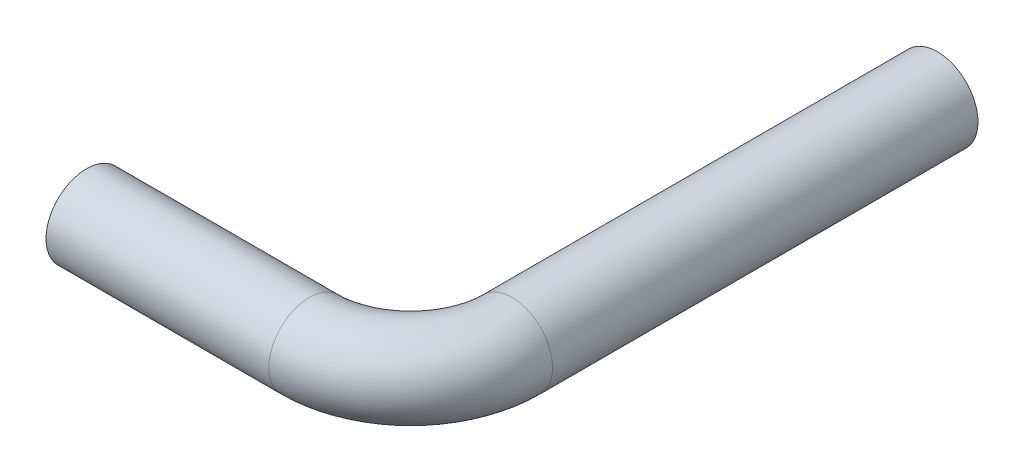
ISO-10303-21;
HEADER;
FILE_DESCRIPTION(('STEP AP214'),'2;1');
FILE_NAME('part.step','',(''),(''),'','','');
FILE_SCHEMA(('AUTOMOTIVE_DESIGN { 1 0 10303 214 1 1 1 1 }'));
ENDSEC;
DATA;
#1=APPLICATION_CONTEXT('core data for automotive mechanical design processes');
#2=APPLICATION_PROTOCOL_DEFINITION('international standard','automotive_design',2000,#1);
#3=PRODUCT_CONTEXT('',#1,'mechanical');
#4=PRODUCT('Part','Part','',(#3));
#5=PRODUCT_RELATED_PRODUCT_CATEGORY('part','',(#4));
#6=PRODUCT_DEFINITION_FORMATION('','',#4);
#7=PRODUCT_DEFINITION_CONTEXT('part definition',#1,'design');
#8=PRODUCT_DEFINITION('design','',#6,#7);
#9=PRODUCT_DEFINITION_SHAPE('','',#8);
#10=(LENGTH_UNIT() NAMED_UNIT(*) SI_UNIT(.MILLI.,.METRE.));
#11=(NAMED_UNIT(*) PLANE_ANGLE_UNIT() SI_UNIT($,.RADIAN.));
#12=(NAMED_UNIT(*) SI_UNIT($,.STERADIAN.) SOLID_ANGLE_UNIT());
#13=UNCERTAINTY_MEASURE_WITH_UNIT(LENGTH_MEASURE(1.E-05),#10,'distance_accuracy_value','');
#14=(GEOMETRIC_REPRESENTATION_CONTEXT(3) GLOBAL_UNCERTAINTY_ASSIGNED_CONTEXT((#13)) GLOBAL_UNIT_ASSIGNED_CONTEXT((#10,
#11,#12)) REPRESENTATION_CONTEXT('',''));
#15=CARTESIAN_POINT('',(0.,0.,0.));
#16=DIRECTION('',(0.,0.,1.));
#17=DIRECTION('',(1.,0.,0.));
#18=AXIS2_PLACEMENT_3D('',#15,#16,#17);
#19=CARTESIAN_POINT('',(148.,21.,95.));
#20=DIRECTION('',(-1.,0.,0.));
#21=DIRECTION('',(0.,0.,1.));
#22=AXIS2_PLACEMENT_3D('',#19,#20,#21);
#23=PLANE('',#22);
#24=CARTESIAN_POINT('',(148.,21.,95.));
#25=DIRECTION('',(-1.,0.,0.));
#26=DIRECTION('',(0.,0.,1.));
#27=AXIS2_PLACEMENT_3D('',#24,#25,#26);
#28=CIRCLE('',#27,3.);
#29=CARTESIAN_POINT('',(148.,21.,98.));
#30=VERTEX_POINT('',#29);
#31=EDGE_CURVE('E88',#30,#30,#28,.T.);
#32=ORIENTED_EDGE('',*,*,#31,.F.);
#33=EDGE_LOOP('',(#32));
#34=FACE_BOUND('',#33,.T.);
#35=CARTESIAN_POINT('',(148.,21.,95.));
#36=DIRECTION('',(-1.,0.,0.));
#37=DIRECTION('',(0.,0.,1.));
#38=AXIS2_PLACEMENT_3D('',#35,#36,#37);
#39=CIRCLE('',#38,4.);
#40=CARTESIAN_POINT('',(148.,21.,99.));
#41=VERTEX_POINT('',#40);
#42=EDGE_CURVE('E67',#41,#41,#39,.T.);
#43=ORIENTED_EDGE('',*,*,#42,.T.);
#44=EDGE_LOOP('',(#43));
#45=FACE_BOUND('',#44,.T.);
#46=ADVANCED_FACE('F52',(#34,#45),#23,.T.);
#47=CARTESIAN_POINT('',(180.,21.,43.));
#48=DIRECTION('',(0.,0.,1.));
#49=DIRECTION('',(1.,0.,0.));
#50=AXIS2_PLACEMENT_3D('',#47,#48,#49);
#51=PLANE('',#50);
#52=CARTESIAN_POINT('',(180.,21.,43.));
#53=DIRECTION('',(0.,0.,1.));
#54=DIRECTION('',(1.,0.,0.));
#55=AXIS2_PLACEMENT_3D('',#52,#53,#54);
#56=CIRCLE('',#55,3.);
#57=CARTESIAN_POINT('',(183.,21.,43.));
#58=VERTEX_POINT('',#57);
#59=EDGE_CURVE('E71',#58,#58,#56,.T.);
#60=ORIENTED_EDGE('',*,*,#59,.T.);
#61=EDGE_LOOP('',(#60));
#62=FACE_BOUND('',#61,.T.);
#63=CARTESIAN_POINT('',(180.,21.,43.));
#64=DIRECTION('',(0.,0.,1.));
#65=DIRECTION('',(1.,0.,0.));
#66=AXIS2_PLACEMENT_3D('',#63,#64,#65);
#67=CIRCLE('',#66,4.);
#68=CARTESIAN_POINT('',(184.,21.,43.));
#69=VERTEX_POINT('',#68);
#70=EDGE_CURVE('E11',#69,#69,#67,.T.);
#71=ORIENTED_EDGE('',*,*,#70,.F.);
#72=EDGE_LOOP('',(#71));
#73=FACE_BOUND('',#72,.T.);
#74=ADVANCED_FACE('F91',(#62,#73),#51,.F.);
#75=CARTESIAN_POINT('',(148.,21.,95.));
#76=DIRECTION('',(1.,0.,0.));
#77=DIRECTION('',(0.,0.,-1.));
#78=AXIS2_PLACEMENT_3D('',#75,#76,#77);
#79=CYLINDRICAL_SURFACE('',#78,4.);
#80=CARTESIAN_POINT('',(170.,21.,95.));
#81=DIRECTION('',(1.,0.,0.));
#82=DIRECTION('',(0.,0.,-1.));
#83=AXIS2_PLACEMENT_3D('',#80,#81,#82);
#84=CIRCLE('',#83,4.);
#85=CARTESIAN_POINT('',(170.,21.,99.));
#86=VERTEX_POINT('',#85);
#87=EDGE_CURVE('E63',#86,#86,#84,.F.);
#88=ORIENTED_EDGE('',*,*,#87,.T.);
#89=EDGE_LOOP('',(#88));
#90=FACE_BOUND('',#89,.T.);
#91=ORIENTED_EDGE('',*,*,#42,.F.);
#92=EDGE_LOOP('',(#91));
#93=FACE_BOUND('',#92,.T.);
#94=ADVANCED_FACE('F97',(#90,#93),#79,.T.);
#95=CARTESIAN_POINT('',(170.,21.,85.));
#96=DIRECTION('',(0.,1.,0.));
#97=DIRECTION('',(0.,0.,1.));
#98=AXIS2_PLACEMENT_3D('',#95,#96,#97);
#99=TOROIDAL_SURFACE('',#98,9.99999999999999,4.);
#100=CARTESIAN_POINT('',(180.,21.,85.));
#101=DIRECTION('',(0.,0.,1.));
#102=DIRECTION('',(1.,0.,0.));
#103=AXIS2_PLACEMENT_3D('',#100,#101,#102);
#104=CIRCLE('',#103,4.);
#105=CARTESIAN_POINT('',(184.,21.,85.));
#106=VERTEX_POINT('',#105);
#107=EDGE_CURVE('E58',#106,#106,#104,.T.);
#108=CARTESIAN_POINT('',(170.,21.,85.));
#109=DIRECTION('',(0.,1.,0.));
#110=DIRECTION('',(0.,0.,1.));
#111=AXIS2_PLACEMENT_3D('',#108,#109,#110);
#112=CIRCLE('',#111,14.);
#113=EDGE_CURVE('',#86,#106,#112,.T.);
#114=ORIENTED_EDGE('',*,*,#87,.F.);
#115=ORIENTED_EDGE('',*,*,#107,.T.);
#116=ORIENTED_EDGE('',*,*,#113,.T.);
#117=ORIENTED_EDGE('',*,*,#113,.F.);
#118=EDGE_LOOP('',(#114,#116,#115,#117));
#119=FACE_BOUND('',#118,.T.);
#120=ADVANCED_FACE('F110',(#119),#99,.T.);
#121=CARTESIAN_POINT('',(180.,21.,85.));
#122=DIRECTION('',(0.,0.,-1.));
#123=DIRECTION('',(-1.,0.,0.));
#124=AXIS2_PLACEMENT_3D('',#121,#122,#123);
#125=CYLINDRICAL_SURFACE('',#124,4.);
#126=ORIENTED_EDGE('',*,*,#70,.T.);
#127=EDGE_LOOP('',(#126));
#128=FACE_BOUND('',#127,.T.);
#129=ORIENTED_EDGE('',*,*,#107,.F.);
#130=EDGE_LOOP('',(#129));
#131=FACE_BOUND('',#130,.T.);
#132=ADVANCED_FACE('F54',(#128,#131),#125,.T.);
#133=CARTESIAN_POINT('',(148.,21.,95.));
#134=DIRECTION('',(1.,0.,0.));
#135=DIRECTION('',(0.,0.,-1.));
#136=AXIS2_PLACEMENT_3D('',#133,#134,#135);
#137=CYLINDRICAL_SURFACE('',#136,3.);
#138=CARTESIAN_POINT('',(170.,21.,95.));
#139=DIRECTION('',(-1.,0.,0.));
#140=DIRECTION('',(0.,0.,1.));
#141=AXIS2_PLACEMENT_3D('',#138,#139,#140);
#142=CIRCLE('',#141,3.);
#143=CARTESIAN_POINT('',(170.,21.,98.));
#144=VERTEX_POINT('',#143);
#145=EDGE_CURVE('E81',#144,#144,#142,.T.);
#146=ORIENTED_EDGE('',*,*,#145,.F.);
#147=EDGE_LOOP('',(#146));
#148=FACE_BOUND('',#147,.T.);
#149=ORIENTED_EDGE('',*,*,#31,.T.);
#150=EDGE_LOOP('',(#149));
#151=FACE_BOUND('',#150,.T.);
#152=ADVANCED_FACE('F89',(#148,#151),#137,.F.);
#153=CARTESIAN_POINT('',(170.,21.,85.));
#154=DIRECTION('',(0.,1.,0.));
#155=DIRECTION('',(0.,0.,1.));
#156=AXIS2_PLACEMENT_3D('',#153,#154,#155);
#157=TOROIDAL_SURFACE('',#156,9.99999999999999,3.);
#158=CARTESIAN_POINT('',(180.,21.,85.));
#159=DIRECTION('',(0.,0.,1.));
#160=DIRECTION('',(1.,0.,0.));
#161=AXIS2_PLACEMENT_3D('',#158,#159,#160);
#162=CIRCLE('',#161,3.);
#163=CARTESIAN_POINT('',(183.,21.,85.));
#164=VERTEX_POINT('',#163);
#165=EDGE_CURVE('E80',#164,#164,#162,.T.);
#166=CARTESIAN_POINT('',(170.,21.,85.));
#167=DIRECTION('',(0.,1.,0.));
#168=DIRECTION('',(0.,0.,1.));
#169=AXIS2_PLACEMENT_3D('',#166,#167,#168);
#170=CIRCLE('',#169,13.);
#171=EDGE_CURVE('',#144,#164,#170,.T.);
#172=ORIENTED_EDGE('',*,*,#145,.T.);
#173=ORIENTED_EDGE('',*,*,#165,.F.);
#174=ORIENTED_EDGE('',*,*,#171,.T.);
#175=ORIENTED_EDGE('',*,*,#171,.F.);
#176=EDGE_LOOP('',(#172,#174,#173,#175));
#177=FACE_BOUND('',#176,.T.);
#178=ADVANCED_FACE('F103',(#177),#157,.F.);
#179=CARTESIAN_POINT('',(180.,21.,85.));
#180=DIRECTION('',(0.,0.,-1.));
#181=DIRECTION('',(-1.,0.,0.));
#182=AXIS2_PLACEMENT_3D('',#179,#180,#181);
#183=CYLINDRICAL_SURFACE('',#182,3.);
#184=ORIENTED_EDGE('',*,*,#59,.F.);
#185=EDGE_LOOP('',(#184));
#186=FACE_BOUND('',#185,.T.);
#187=ORIENTED_EDGE('',*,*,#165,.T.);
#188=EDGE_LOOP('',(#187));
#189=FACE_BOUND('',#188,.T.);
#190=ADVANCED_FACE('F92',(#186,#189),#183,.F.);
#191=CLOSED_SHELL('',(#46,#74,#94,#120,#132,#152,#178,#190));
#192=MANIFOLD_SOLID_BREP('B2',#191);
#193=ADVANCED_BREP_SHAPE_REPRESENTATION('',(#18,#192),#14);
#194=SHAPE_DEFINITION_REPRESENTATION(#9,#193);
ENDSEC;
END-ISO-10303-21;
